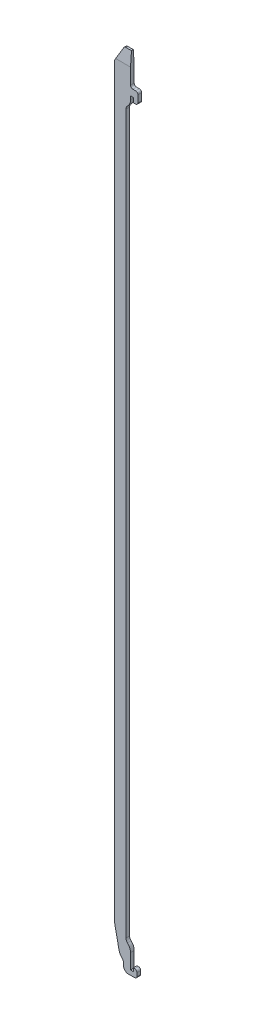
ISO-10303-21;
HEADER;
FILE_DESCRIPTION(('STEP AP214'),'2;1');
FILE_NAME('part.step','',(''),(''),'','','');
FILE_SCHEMA(('AUTOMOTIVE_DESIGN { 1 0 10303 214 1 1 1 1 }'));
ENDSEC;
DATA;
#1=APPLICATION_CONTEXT('core data for automotive mechanical design processes');
#2=APPLICATION_PROTOCOL_DEFINITION('international standard','automotive_design',2000,#1);
#3=PRODUCT_CONTEXT('',#1,'mechanical');
#4=PRODUCT('Part','Part','',(#3));
#5=PRODUCT_RELATED_PRODUCT_CATEGORY('part','',(#4));
#6=PRODUCT_DEFINITION_FORMATION('','',#4);
#7=PRODUCT_DEFINITION_CONTEXT('part definition',#1,'design');
#8=PRODUCT_DEFINITION('design','',#6,#7);
#9=PRODUCT_DEFINITION_SHAPE('','',#8);
#10=(LENGTH_UNIT() NAMED_UNIT(*) SI_UNIT(.MILLI.,.METRE.));
#11=(NAMED_UNIT(*) PLANE_ANGLE_UNIT() SI_UNIT($,.RADIAN.));
#12=(NAMED_UNIT(*) SI_UNIT($,.STERADIAN.) SOLID_ANGLE_UNIT());
#13=UNCERTAINTY_MEASURE_WITH_UNIT(LENGTH_MEASURE(1.E-05),#10,'distance_accuracy_value','');
#14=(GEOMETRIC_REPRESENTATION_CONTEXT(3) GLOBAL_UNCERTAINTY_ASSIGNED_CONTEXT((#13)) GLOBAL_UNIT_ASSIGNED_CONTEXT((#10,
#11,#12)) REPRESENTATION_CONTEXT('',''));
#15=CARTESIAN_POINT('',(0.,0.,0.));
#16=DIRECTION('',(0.,0.,1.));
#17=DIRECTION('',(1.,0.,0.));
#18=AXIS2_PLACEMENT_3D('',#15,#16,#17);
#19=CARTESIAN_POINT('',(0.,1737.,4.));
#20=DIRECTION('',(0.,-1.,0.));
#21=DIRECTION('',(0.,0.,-1.));
#22=AXIS2_PLACEMENT_3D('',#19,#20,#21);
#23=PLANE('',#22);
#24=DIRECTION('',(1.,0.,0.));
#25=VECTOR('',#24,1.);
#26=CARTESIAN_POINT('',(-35.0000000000001,1737.,-2.));
#27=LINE('',#26,#25);
#28=CARTESIAN_POINT('',(-12.1132486540519,1737.,-2.));
#29=VERTEX_POINT('',#28);
#30=CARTESIAN_POINT('',(0.,1737.,-2.));
#31=VERTEX_POINT('',#30);
#32=EDGE_CURVE('E275',#29,#31,#27,.T.);
#33=ORIENTED_EDGE('',*,*,#32,.F.);
#34=DIRECTION('',(0.,0.,-1.));
#35=VECTOR('',#34,1.);
#36=CARTESIAN_POINT('',(-12.1132486540519,1737.,4.));
#37=LINE('',#36,#35);
#38=CARTESIAN_POINT('',(-12.1132486540519,1737.,2.));
#39=VERTEX_POINT('',#38);
#40=EDGE_CURVE('E67',#29,#39,#37,.F.);
#41=ORIENTED_EDGE('',*,*,#40,.T.);
#42=DIRECTION('',(1.,0.,0.));
#43=VECTOR('',#42,1.);
#44=CARTESIAN_POINT('',(-35.0000000000001,1737.,2.));
#45=LINE('',#44,#43);
#46=CARTESIAN_POINT('',(0.,1737.,2.));
#47=VERTEX_POINT('',#46);
#48=EDGE_CURVE('E458',#39,#47,#45,.T.);
#49=ORIENTED_EDGE('',*,*,#48,.T.);
#50=DIRECTION('',(0.,0.,-1.));
#51=VECTOR('',#50,1.);
#52=CARTESIAN_POINT('',(0.,1737.,4.));
#53=LINE('',#52,#51);
#54=EDGE_CURVE('E305',#47,#31,#53,.T.);
#55=ORIENTED_EDGE('',*,*,#54,.T.);
#56=EDGE_LOOP('',(#33,#41,#49,#55));
#57=FACE_BOUND('',#56,.T.);
#58=ADVANCED_FACE('F45',(#57),#23,.F.);
#59=CARTESIAN_POINT('',(0.,1668.,4.));
#60=DIRECTION('',(-1.,0.,0.));
#61=DIRECTION('',(0.,-1.,0.));
#62=AXIS2_PLACEMENT_3D('',#59,#60,#61);
#63=PLANE('',#62);
#64=DIRECTION('',(0.,0.997785157856609,0.0665190105237739));
#65=VECTOR('',#64,1.);
#66=CARTESIAN_POINT('',(0.,1737.,-2.));
#67=LINE('',#66,#65);
#68=CARTESIAN_POINT('',(0.,1707.,-4.));
#69=VERTEX_POINT('',#68);
#70=EDGE_CURVE('E271',#69,#31,#67,.T.);
#71=ORIENTED_EDGE('',*,*,#70,.T.);
#72=ORIENTED_EDGE('',*,*,#54,.F.);
#73=DIRECTION('',(0.,0.997785157856609,-0.0665190105237739));
#74=VECTOR('',#73,1.);
#75=CARTESIAN_POINT('',(0.,1737.,2.));
#76=LINE('',#75,#74);
#77=CARTESIAN_POINT('',(0.,1707.,4.));
#78=VERTEX_POINT('',#77);
#79=EDGE_CURVE('E469',#78,#47,#76,.T.);
#80=ORIENTED_EDGE('',*,*,#79,.F.);
#81=DIRECTION('',(0.,1.,0.));
#82=VECTOR('',#81,1.);
#83=CARTESIAN_POINT('',(0.,1668.,4.));
#84=LINE('',#83,#82);
#85=CARTESIAN_POINT('',(0.,1673.,4.));
#86=VERTEX_POINT('',#85);
#87=EDGE_CURVE('E308',#86,#78,#84,.T.);
#88=ORIENTED_EDGE('',*,*,#87,.F.);
#89=DIRECTION('',(0.,0.,-1.));
#90=VECTOR('',#89,1.);
#91=CARTESIAN_POINT('',(0.,1673.,-4.));
#92=LINE('',#91,#90);
#93=CARTESIAN_POINT('',(0.,1673.,-4.));
#94=VERTEX_POINT('',#93);
#95=EDGE_CURVE('E293',#86,#94,#92,.T.);
#96=ORIENTED_EDGE('',*,*,#95,.T.);
#97=DIRECTION('',(0.,1.,0.));
#98=VECTOR('',#97,1.);
#99=CARTESIAN_POINT('',(0.,1668.,-4.));
#100=LINE('',#99,#98);
#101=EDGE_CURVE('E285',#94,#69,#100,.T.);
#102=ORIENTED_EDGE('',*,*,#101,.T.);
#103=EDGE_LOOP('',(#71,#72,#80,#88,#96,#102));
#104=FACE_BOUND('',#103,.T.);
#105=ADVANCED_FACE('F290',(#104),#63,.F.);
#106=CARTESIAN_POINT('',(0.,0.,-4.));
#107=DIRECTION('',(0.,0.,-1.));
#108=DIRECTION('',(-1.,0.,0.));
#109=AXIS2_PLACEMENT_3D('',#106,#107,#108);
#110=PLANE('',#109);
#111=DIRECTION('',(-0.499999999999999,-0.866025403784439,0.));
#112=VECTOR('',#111,1.);
#113=CARTESIAN_POINT('',(-763.393063186784,440.745190528381,-4.));
#114=LINE('',#113,#112);
#115=CARTESIAN_POINT('',(-34.3301270189224,1703.51923788647,-4.));
#116=VERTEX_POINT('',#115);
#117=CARTESIAN_POINT('',(-32.3205080756888,1707.,-4.));
#118=VERTEX_POINT('',#117);
#119=EDGE_CURVE('E287',#116,#118,#114,.F.);
#120=ORIENTED_EDGE('',*,*,#119,.T.);
#121=DIRECTION('',(1.,0.,0.));
#122=VECTOR('',#121,1.);
#123=CARTESIAN_POINT('',(-35.0000000000001,1707.,-4.));
#124=LINE('',#123,#122);
#125=EDGE_CURVE('E274',#118,#69,#124,.T.);
#126=ORIENTED_EDGE('',*,*,#125,.T.);
#127=ORIENTED_EDGE('',*,*,#101,.F.);
#128=CARTESIAN_POINT('',(5.00000000000008,1673.,-4.));
#129=DIRECTION('',(0.,0.,-1.));
#130=DIRECTION('',(-1.,0.,0.));
#131=AXIS2_PLACEMENT_3D('',#128,#129,#130);
#132=CIRCLE('',#131,5.);
#133=CARTESIAN_POINT('',(5.00000000000008,1668.,-4.));
#134=VERTEX_POINT('',#133);
#135=EDGE_CURVE('E384',#94,#134,#132,.F.);
#136=ORIENTED_EDGE('',*,*,#135,.T.);
#137=DIRECTION('',(-1.,0.,0.));
#138=VECTOR('',#137,1.);
#139=CARTESIAN_POINT('',(15.9999999999999,1668.,-4.));
#140=LINE('',#139,#138);
#141=CARTESIAN_POINT('',(10.9999999999999,1668.,-4.));
#142=VERTEX_POINT('',#141);
#143=EDGE_CURVE('E295',#142,#134,#140,.T.);
#144=ORIENTED_EDGE('',*,*,#143,.F.);
#145=CARTESIAN_POINT('',(10.9999999999999,1663.,-4.));
#146=DIRECTION('',(0.,0.,-1.));
#147=DIRECTION('',(-1.,0.,0.));
#148=AXIS2_PLACEMENT_3D('',#145,#146,#147);
#149=CIRCLE('',#148,5.);
#150=CARTESIAN_POINT('',(15.9999999999999,1663.,-4.));
#151=VERTEX_POINT('',#150);
#152=EDGE_CURVE('E334',#142,#151,#149,.T.);
#153=ORIENTED_EDGE('',*,*,#152,.T.);
#154=DIRECTION('',(0.,1.,0.));
#155=VECTOR('',#154,1.);
#156=CARTESIAN_POINT('',(15.9999999999999,1643.,-4.));
#157=LINE('',#156,#155);
#158=CARTESIAN_POINT('',(15.9999999999999,1648.,-4.));
#159=VERTEX_POINT('',#158);
#160=EDGE_CURVE('E301',#159,#151,#157,.T.);
#161=ORIENTED_EDGE('',*,*,#160,.F.);
#162=CARTESIAN_POINT('',(10.9999999999999,1648.,-4.));
#163=DIRECTION('',(0.,0.,-1.));
#164=DIRECTION('',(-1.,0.,0.));
#165=AXIS2_PLACEMENT_3D('',#162,#163,#164);
#166=CIRCLE('',#165,5.);
#167=CARTESIAN_POINT('',(10.9999999999998,1643.,-4.));
#168=VERTEX_POINT('',#167);
#169=EDGE_CURVE('E336',#159,#168,#166,.T.);
#170=ORIENTED_EDGE('',*,*,#169,.T.);
#171=DIRECTION('',(1.,0.,0.));
#172=VECTOR('',#171,1.);
#173=CARTESIAN_POINT('',(5.9999999999999,1643.,-4.));
#174=LINE('',#173,#172);
#175=CARTESIAN_POINT('',(5.9999999999999,1643.,-4.));
#176=VERTEX_POINT('',#175);
#177=EDGE_CURVE('E540',#176,#168,#174,.T.);
#178=ORIENTED_EDGE('',*,*,#177,.F.);
#179=DIRECTION('',(0.,-1.,0.));
#180=VECTOR('',#179,1.);
#181=CARTESIAN_POINT('',(5.9999999999999,1653.,-4.));
#182=LINE('',#181,#180);
#183=CARTESIAN_POINT('',(5.9999999999999,1653.,-4.));
#184=VERTEX_POINT('',#183);
#185=EDGE_CURVE('E538',#184,#176,#182,.T.);
#186=ORIENTED_EDGE('',*,*,#185,.F.);
#187=DIRECTION('',(1.,0.,0.));
#188=VECTOR('',#187,1.);
#189=CARTESIAN_POINT('',(0.,1653.,-4.));
#190=LINE('',#189,#188);
#191=CARTESIAN_POINT('',(0.,1653.,-4.));
#192=VERTEX_POINT('',#191);
#193=EDGE_CURVE('E536',#192,#184,#190,.T.);
#194=ORIENTED_EDGE('',*,*,#193,.F.);
#195=DIRECTION('',(0.,1.,0.));
#196=VECTOR('',#195,1.);
#197=CARTESIAN_POINT('',(0.,1653.,-4.));
#198=LINE('',#197,#196);
#199=CARTESIAN_POINT('',(0.,1645.32050807569,-4.));
#200=VERTEX_POINT('',#199);
#201=EDGE_CURVE('E532',#200,#192,#198,.T.);
#202=ORIENTED_EDGE('',*,*,#201,.F.);
#203=CARTESIAN_POINT('',(-20.0000000000001,1645.32050807569,-4.));
#204=DIRECTION('',(0.,0.,-1.));
#205=DIRECTION('',(-1.,0.,0.));
#206=AXIS2_PLACEMENT_3D('',#203,#204,#205);
#207=CIRCLE('',#206,20.);
#208=CARTESIAN_POINT('',(-6.66666666666673,1630.41338822569,-4.));
#209=VERTEX_POINT('',#208);
#210=EDGE_CURVE('E393',#200,#209,#207,.T.);
#211=ORIENTED_EDGE('',*,*,#210,.T.);
#212=CARTESIAN_POINT('',(0.,1622.95982830069,-4.));
#213=DIRECTION('',(0.,0.,-1.));
#214=DIRECTION('',(-1.,0.,0.));
#215=AXIS2_PLACEMENT_3D('',#212,#213,#214);
#216=CIRCLE('',#215,10.);
#217=CARTESIAN_POINT('',(-10.,1622.95982830069,-4.));
#218=VERTEX_POINT('',#217);
#219=EDGE_CURVE('E416',#209,#218,#216,.F.);
#220=ORIENTED_EDGE('',*,*,#219,.T.);
#221=DIRECTION('',(0.,-1.,0.));
#222=VECTOR('',#221,1.);
#223=CARTESIAN_POINT('',(-10.,60.,-4.));
#224=LINE('',#223,#222);
#225=CARTESIAN_POINT('',(-10.,65.0401716993091,-4.));
#226=VERTEX_POINT('',#225);
#227=EDGE_CURVE('E484',#218,#226,#224,.T.);
#228=ORIENTED_EDGE('',*,*,#227,.T.);
#229=CARTESIAN_POINT('',(0.,65.0401716993091,-4.));
#230=DIRECTION('',(0.,0.,-1.));
#231=DIRECTION('',(-1.,0.,0.));
#232=AXIS2_PLACEMENT_3D('',#229,#230,#231);
#233=CIRCLE('',#232,10.);
#234=CARTESIAN_POINT('',(-6.66666666666667,57.5866117743098,-4.));
#235=VERTEX_POINT('',#234);
#236=EDGE_CURVE('E420',#226,#235,#233,.F.);
#237=ORIENTED_EDGE('',*,*,#236,.T.);
#238=CARTESIAN_POINT('',(-20.,42.6794919243112,-4.));
#239=DIRECTION('',(0.,0.,-1.));
#240=DIRECTION('',(-1.,0.,0.));
#241=AXIS2_PLACEMENT_3D('',#238,#239,#240);
#242=CIRCLE('',#241,20.);
#243=CARTESIAN_POINT('',(0.,42.6794919243112,-4.));
#244=VERTEX_POINT('',#243);
#245=EDGE_CURVE('E391',#235,#244,#242,.T.);
#246=ORIENTED_EDGE('',*,*,#245,.T.);
#247=CARTESIAN_POINT('',(0.,10.,-4.));
#248=VERTEX_POINT('',#247);
#249=EDGE_CURVE('E533',#248,#244,#198,.T.);
#250=ORIENTED_EDGE('',*,*,#249,.F.);
#251=DIRECTION('',(-1.,0.,0.));
#252=VECTOR('',#251,1.);
#253=CARTESIAN_POINT('',(0.,10.,-4.));
#254=LINE('',#253,#252);
#255=CARTESIAN_POINT('',(5.99999999999999,10.,-4.));
#256=VERTEX_POINT('',#255);
#257=EDGE_CURVE('E530',#256,#248,#254,.T.);
#258=ORIENTED_EDGE('',*,*,#257,.F.);
#259=DIRECTION('',(0.,-1.,0.));
#260=VECTOR('',#259,1.);
#261=CARTESIAN_POINT('',(5.99999999999999,10.,-4.));
#262=LINE('',#261,#260);
#263=CARTESIAN_POINT('',(5.99999999999999,17.,-4.));
#264=VERTEX_POINT('',#263);
#265=EDGE_CURVE('E528',#264,#256,#262,.T.);
#266=ORIENTED_EDGE('',*,*,#265,.F.);
#267=DIRECTION('',(-1.,0.,0.));
#268=VECTOR('',#267,1.);
#269=CARTESIAN_POINT('',(5.99999999999999,17.,-4.));
#270=LINE('',#269,#268);
#271=CARTESIAN_POINT('',(9.,17.,-4.));
#272=VERTEX_POINT('',#271);
#273=EDGE_CURVE('E526',#272,#264,#270,.T.);
#274=ORIENTED_EDGE('',*,*,#273,.F.);
#275=CARTESIAN_POINT('',(9.,12.,-4.));
#276=DIRECTION('',(0.,0.,-1.));
#277=DIRECTION('',(-1.,0.,0.));
#278=AXIS2_PLACEMENT_3D('',#275,#276,#277);
#279=CIRCLE('',#278,5.);
#280=CARTESIAN_POINT('',(14.,12.,-4.));
#281=VERTEX_POINT('',#280);
#282=EDGE_CURVE('E340',#272,#281,#279,.T.);
#283=ORIENTED_EDGE('',*,*,#282,.T.);
#284=DIRECTION('',(0.,1.,0.));
#285=VECTOR('',#284,1.);
#286=CARTESIAN_POINT('',(14.,17.,-4.));
#287=LINE('',#286,#285);
#288=CARTESIAN_POINT('',(14.,5.,-4.));
#289=VERTEX_POINT('',#288);
#290=EDGE_CURVE('E523',#289,#281,#287,.T.);
#291=ORIENTED_EDGE('',*,*,#290,.F.);
#292=CARTESIAN_POINT('',(9.,5.,-4.));
#293=DIRECTION('',(0.,0.,-1.));
#294=DIRECTION('',(-1.,0.,0.));
#295=AXIS2_PLACEMENT_3D('',#292,#293,#294);
#296=CIRCLE('',#295,5.);
#297=CARTESIAN_POINT('',(9.,0.,-4.));
#298=VERTEX_POINT('',#297);
#299=EDGE_CURVE('E342',#289,#298,#296,.T.);
#300=ORIENTED_EDGE('',*,*,#299,.T.);
#301=DIRECTION('',(1.,0.,0.));
#302=VECTOR('',#301,1.);
#303=CARTESIAN_POINT('',(-35.0000000000001,0.,-4.));
#304=LINE('',#303,#302);
#305=CARTESIAN_POINT('',(-5.0000000000001,0.,-4.));
#306=VERTEX_POINT('',#305);
#307=EDGE_CURVE('E521',#306,#298,#304,.T.);
#308=ORIENTED_EDGE('',*,*,#307,.F.);
#309=CARTESIAN_POINT('',(-5.0000000000001,10.,-4.));
#310=DIRECTION('',(0.,0.,-1.));
#311=DIRECTION('',(-1.,0.,0.));
#312=AXIS2_PLACEMENT_3D('',#309,#310,#311);
#313=CIRCLE('',#312,10.);
#314=CARTESIAN_POINT('',(-15.0000000000001,10.,-4.));
#315=VERTEX_POINT('',#314);
#316=EDGE_CURVE('E434',#306,#315,#313,.T.);
#317=ORIENTED_EDGE('',*,*,#316,.T.);
#318=DIRECTION('',(0.,1.,0.));
#319=VECTOR('',#318,1.);
#320=CARTESIAN_POINT('',(-15.0000000000001,15.,-4.));
#321=LINE('',#320,#319);
#322=CARTESIAN_POINT('',(-15.0000000000001,15.,-4.));
#323=VERTEX_POINT('',#322);
#324=EDGE_CURVE('E464',#315,#323,#321,.T.);
#325=ORIENTED_EDGE('',*,*,#324,.T.);
#326=CARTESIAN_POINT('',(-25.0000000000001,15.,-4.));
#327=DIRECTION('',(0.,0.,1.));
#328=DIRECTION('',(1.,0.,0.));
#329=AXIS2_PLACEMENT_3D('',#326,#327,#328);
#330=CIRCLE('',#329,10.);
#331=CARTESIAN_POINT('',(-17.7193766126247,21.8551092690929,-4.));
#332=VERTEX_POINT('',#331);
#333=EDGE_CURVE('E476',#323,#332,#330,.T.);
#334=ORIENTED_EDGE('',*,*,#333,.T.);
#335=CARTESIAN_POINT('',(4.1224935495014,42.4204370763714,-4.));
#336=DIRECTION('',(0.,0.,-1.));
#337=DIRECTION('',(-1.,0.,0.));
#338=AXIS2_PLACEMENT_3D('',#335,#336,#337);
#339=CIRCLE('',#338,30.);
#340=CARTESIAN_POINT('',(-25.2535850716724,36.3338941460525,-4.));
#341=VERTEX_POINT('',#340);
#342=EDGE_CURVE('E447',#332,#341,#339,.T.);
#343=ORIENTED_EDGE('',*,*,#342,.T.);
#344=DIRECTION('',(0.202884764343964,-0.979202620705794,0.));
#345=VECTOR('',#344,1.);
#346=CARTESIAN_POINT('',(-16.9958075307362,-3.52142685568323,-4.));
#347=LINE('',#346,#345);
#348=CARTESIAN_POINT('',(-35.0000000000001,83.3739716558868,-4.));
#349=VERTEX_POINT('',#348);
#350=EDGE_CURVE('E442',#341,#349,#347,.F.);
#351=ORIENTED_EDGE('',*,*,#350,.T.);
#352=DIRECTION('',(0.,-1.,0.));
#353=VECTOR('',#352,1.);
#354=CARTESIAN_POINT('',(-35.0000000000001,0.,-4.));
#355=LINE('',#354,#353);
#356=CARTESIAN_POINT('',(-35.0000000000001,1701.01923788647,-4.));
#357=VERTEX_POINT('',#356);
#358=EDGE_CURVE('E487',#357,#349,#355,.T.);
#359=ORIENTED_EDGE('',*,*,#358,.F.);
#360=CARTESIAN_POINT('',(-30.0000000000001,1701.01923788647,-4.));
#361=DIRECTION('',(0.,0.,-1.));
#362=DIRECTION('',(-1.,0.,0.));
#363=AXIS2_PLACEMENT_3D('',#360,#361,#362);
#364=CIRCLE('',#363,5.);
#365=EDGE_CURVE('E338',#357,#116,#364,.T.);
#366=ORIENTED_EDGE('',*,*,#365,.T.);
#367=EDGE_LOOP('',(#120,#126,#127,#136,#144,#153,#161,#170,#178,#186,#194,#202,#211,#220,#228,
#237,#246,#250,#258,#266,#274,#283,#291,#300,#308,#317,#325,#334,#343,#351,#359,#366));
#368=FACE_BOUND('',#367,.T.);
#369=ADVANCED_FACE('F284',(#368),#110,.T.);
#370=CARTESIAN_POINT('',(-35.0000000000001,1702.35898384862,4.));
#371=DIRECTION('',(0.866025403784439,-0.499999999999999,0.));
#372=DIRECTION('',(0.,0.,-1.));
#373=AXIS2_PLACEMENT_3D('',#370,#371,#372);
#374=PLANE('',#373);
#375=DIRECTION('',(0.,0.,1.));
#376=VECTOR('',#375,1.);
#377=CARTESIAN_POINT('',(-16.4433756729741,1734.5,-4.));
#378=LINE('',#377,#376);
#379=CARTESIAN_POINT('',(-16.4433756729741,1734.5,2.16666666666666));
#380=VERTEX_POINT('',#379);
#381=CARTESIAN_POINT('',(-16.4433756729741,1734.5,-2.16666666666666));
#382=VERTEX_POINT('',#381);
#383=EDGE_CURVE('E370',#380,#382,#378,.F.);
#384=ORIENTED_EDGE('',*,*,#383,.T.);
#385=DIRECTION('',(0.49916874422979,0.864585626556353,0.0576390417704235));
#386=VECTOR('',#385,1.);
#387=CARTESIAN_POINT('',(-34.7609251686809,1702.77307360328,-4.2817950931148));
#388=LINE('',#387,#386);
#389=EDGE_CURVE('E60',#382,#118,#388,.F.);
#390=ORIENTED_EDGE('',*,*,#389,.T.);
#391=ORIENTED_EDGE('',*,*,#119,.F.);
#392=DIRECTION('',(0.,0.,-1.));
#393=VECTOR('',#392,1.);
#394=CARTESIAN_POINT('',(-34.3301270189223,1703.51923788647,4.));
#395=LINE('',#394,#393);
#396=CARTESIAN_POINT('',(-34.3301270189223,1703.51923788647,4.));
#397=VERTEX_POINT('',#396);
#398=EDGE_CURVE('E373',#116,#397,#395,.F.);
#399=ORIENTED_EDGE('',*,*,#398,.T.);
#400=DIRECTION('',(0.499999999999999,0.866025403784439,0.));
#401=VECTOR('',#400,1.);
#402=CARTESIAN_POINT('',(-35.0000000000001,1702.35898384862,4.));
#403=LINE('',#402,#401);
#404=CARTESIAN_POINT('',(-32.3205080756888,1707.,4.));
#405=VERTEX_POINT('',#404);
#406=EDGE_CURVE('E327',#405,#397,#403,.F.);
#407=ORIENTED_EDGE('',*,*,#406,.F.);
#408=DIRECTION('',(0.49916874422979,0.864585626556353,-0.0576390417704235));
#409=VECTOR('',#408,1.);
#410=CARTESIAN_POINT('',(-34.9910980334742,1702.37440250693,4.3083731662045));
#411=LINE('',#410,#409);
#412=EDGE_CURVE('E456',#380,#405,#411,.F.);
#413=ORIENTED_EDGE('',*,*,#412,.F.);
#414=EDGE_LOOP('',(#384,#390,#391,#399,#407,#413));
#415=FACE_BOUND('',#414,.T.);
#416=ADVANCED_FACE('F463',(#415),#374,.F.);
#417=CARTESIAN_POINT('',(-12.1132486540519,1732.,4.));
#418=DIRECTION('',(0.,0.,1.));
#419=DIRECTION('',(1.,0.,0.));
#420=AXIS2_PLACEMENT_3D('',#417,#418,#419);
#421=CYLINDRICAL_SURFACE('',#420,5.);
#422=ORIENTED_EDGE('',*,*,#40,.F.);
#423=CARTESIAN_POINT('',(-12.1132486540519,1732.,-2.33333333333333));
#424=DIRECTION('',(0.,0.0665190105237739,-0.997785157856609));
#425=DIRECTION('',(0.,0.997785157856609,0.0665190105237739));
#426=AXIS2_PLACEMENT_3D('',#423,#424,#425);
#427=ELLIPSE('',#426,5.01109879279097,5.);
#428=EDGE_CURVE('E11',#29,#382,#427,.F.);
#429=ORIENTED_EDGE('',*,*,#428,.T.);
#430=ORIENTED_EDGE('',*,*,#383,.F.);
#431=CARTESIAN_POINT('',(-12.1132486540519,1732.,2.33333333333333));
#432=DIRECTION('',(0.,-0.0665190105237739,-0.997785157856609));
#433=DIRECTION('',(0.,-0.997785157856609,0.0665190105237739));
#434=AXIS2_PLACEMENT_3D('',#431,#432,#433);
#435=ELLIPSE('',#434,5.01109879279097,5.);
#436=EDGE_CURVE('E53',#39,#380,#435,.F.);
#437=ORIENTED_EDGE('',*,*,#436,.F.);
#438=EDGE_LOOP('',(#422,#429,#430,#437));
#439=FACE_BOUND('',#438,.T.);
#440=ADVANCED_FACE('F467',(#439),#421,.T.);
#441=CARTESIAN_POINT('',(0.,1653.,4.));
#442=DIRECTION('',(-1.,0.,0.));
#443=DIRECTION('',(0.,-1.,0.));
#444=AXIS2_PLACEMENT_3D('',#441,#442,#443);
#445=PLANE('',#444);
#446=ORIENTED_EDGE('',*,*,#249,.T.);
#447=DIRECTION('',(0.,0.,-1.));
#448=VECTOR('',#447,1.);
#449=CARTESIAN_POINT('',(0.,42.6794919243112,4.));
#450=LINE('',#449,#448);
#451=CARTESIAN_POINT('',(0.,42.6794919243112,4.));
#452=VERTEX_POINT('',#451);
#453=EDGE_CURVE('E401',#244,#452,#450,.F.);
#454=ORIENTED_EDGE('',*,*,#453,.T.);
#455=DIRECTION('',(0.,1.,0.));
#456=VECTOR('',#455,1.);
#457=CARTESIAN_POINT('',(0.,1653.,4.));
#458=LINE('',#457,#456);
#459=CARTESIAN_POINT('',(0.,10.,4.));
#460=VERTEX_POINT('',#459);
#461=EDGE_CURVE('E501',#460,#452,#458,.T.);
#462=ORIENTED_EDGE('',*,*,#461,.F.);
#463=DIRECTION('',(0.,0.,-1.));
#464=VECTOR('',#463,1.);
#465=CARTESIAN_POINT('',(0.,10.,4.));
#466=LINE('',#465,#464);
#467=EDGE_CURVE('E317',#460,#248,#466,.T.);
#468=ORIENTED_EDGE('',*,*,#467,.T.);
#469=EDGE_LOOP('',(#446,#454,#462,#468));
#470=FACE_BOUND('',#469,.T.);
#471=ADVANCED_FACE('F630',(#470),#445,.F.);
#472=CARTESIAN_POINT('',(-35.0000000000001,0.,4.));
#473=DIRECTION('',(1.,0.,0.));
#474=DIRECTION('',(0.,0.,-1.));
#475=AXIS2_PLACEMENT_3D('',#472,#473,#474);
#476=PLANE('',#475);
#477=ORIENTED_EDGE('',*,*,#358,.T.);
#478=DIRECTION('',(0.,0.,1.));
#479=VECTOR('',#478,1.);
#480=CARTESIAN_POINT('',(-35.0000000000001,83.3739716558868,4.));
#481=LINE('',#480,#479);
#482=CARTESIAN_POINT('',(-35.0000000000001,83.3739716558868,4.));
#483=VERTEX_POINT('',#482);
#484=EDGE_CURVE('E436',#349,#483,#481,.T.);
#485=ORIENTED_EDGE('',*,*,#484,.T.);
#486=DIRECTION('',(0.,-1.,0.));
#487=VECTOR('',#486,1.);
#488=CARTESIAN_POINT('',(-35.0000000000001,0.,4.));
#489=LINE('',#488,#487);
#490=CARTESIAN_POINT('',(-35.0000000000001,1701.01923788647,4.));
#491=VERTEX_POINT('',#490);
#492=EDGE_CURVE('E294',#491,#483,#489,.T.);
#493=ORIENTED_EDGE('',*,*,#492,.F.);
#494=DIRECTION('',(0.,0.,1.));
#495=VECTOR('',#494,1.);
#496=CARTESIAN_POINT('',(-35.0000000000001,1701.01923788647,-4.));
#497=LINE('',#496,#495);
#498=EDGE_CURVE('E367',#491,#357,#497,.F.);
#499=ORIENTED_EDGE('',*,*,#498,.T.);
#500=EDGE_LOOP('',(#477,#485,#493,#499));
#501=FACE_BOUND('',#500,.T.);
#502=ADVANCED_FACE('F572',(#501),#476,.F.);
#503=CARTESIAN_POINT('',(-35.0000000000001,0.,4.));
#504=DIRECTION('',(0.,1.,0.));
#505=DIRECTION('',(-1.,0.,0.));
#506=AXIS2_PLACEMENT_3D('',#503,#504,#505);
#507=PLANE('',#506);
#508=DIRECTION('',(1.,0.,0.));
#509=VECTOR('',#508,1.);
#510=CARTESIAN_POINT('',(-35.0000000000001,0.,4.));
#511=LINE('',#510,#509);
#512=CARTESIAN_POINT('',(-5.0000000000001,0.,4.));
#513=VERTEX_POINT('',#512);
#514=CARTESIAN_POINT('',(9.,0.,4.));
#515=VERTEX_POINT('',#514);
#516=EDGE_CURVE('E298',#513,#515,#511,.T.);
#517=ORIENTED_EDGE('',*,*,#516,.F.);
#518=DIRECTION('',(0.,0.,1.));
#519=VECTOR('',#518,1.);
#520=CARTESIAN_POINT('',(-5.0000000000001,0.,4.));
#521=LINE('',#520,#519);
#522=EDGE_CURVE('E432',#513,#306,#521,.F.);
#523=ORIENTED_EDGE('',*,*,#522,.T.);
#524=ORIENTED_EDGE('',*,*,#307,.T.);
#525=DIRECTION('',(0.,0.,-1.));
#526=VECTOR('',#525,1.);
#527=CARTESIAN_POINT('',(9.,0.,4.));
#528=LINE('',#527,#526);
#529=EDGE_CURVE('E345',#298,#515,#528,.F.);
#530=ORIENTED_EDGE('',*,*,#529,.T.);
#531=EDGE_LOOP('',(#517,#523,#524,#530));
#532=FACE_BOUND('',#531,.T.);
#533=ADVANCED_FACE('F594',(#532),#507,.F.);
#534=CARTESIAN_POINT('',(14.,17.,4.));
#535=DIRECTION('',(-1.,0.,0.));
#536=DIRECTION('',(0.,-1.,0.));
#537=AXIS2_PLACEMENT_3D('',#534,#535,#536);
#538=PLANE('',#537);
#539=DIRECTION('',(0.,1.,0.));
#540=VECTOR('',#539,1.);
#541=CARTESIAN_POINT('',(14.,17.,4.));
#542=LINE('',#541,#540);
#543=CARTESIAN_POINT('',(14.,5.,4.));
#544=VERTEX_POINT('',#543);
#545=CARTESIAN_POINT('',(14.,12.,4.));
#546=VERTEX_POINT('',#545);
#547=EDGE_CURVE('E491',#544,#546,#542,.T.);
#548=ORIENTED_EDGE('',*,*,#547,.F.);
#549=DIRECTION('',(0.,0.,-1.));
#550=VECTOR('',#549,1.);
#551=CARTESIAN_POINT('',(14.,5.,4.));
#552=LINE('',#551,#550);
#553=EDGE_CURVE('E331',#544,#289,#552,.T.);
#554=ORIENTED_EDGE('',*,*,#553,.T.);
#555=ORIENTED_EDGE('',*,*,#290,.T.);
#556=DIRECTION('',(0.,0.,-1.));
#557=VECTOR('',#556,1.);
#558=CARTESIAN_POINT('',(14.,12.,4.));
#559=LINE('',#558,#557);
#560=EDGE_CURVE('E329',#281,#546,#559,.F.);
#561=ORIENTED_EDGE('',*,*,#560,.T.);
#562=EDGE_LOOP('',(#548,#554,#555,#561));
#563=FACE_BOUND('',#562,.T.);
#564=ADVANCED_FACE('F607',(#563),#538,.F.);
#565=CARTESIAN_POINT('',(5.99999999999999,17.,4.));
#566=DIRECTION('',(0.,-1.,0.));
#567=DIRECTION('',(1.,0.,0.));
#568=AXIS2_PLACEMENT_3D('',#565,#566,#567);
#569=PLANE('',#568);
#570=DIRECTION('',(-1.,0.,0.));
#571=VECTOR('',#570,1.);
#572=CARTESIAN_POINT('',(5.99999999999999,17.,4.));
#573=LINE('',#572,#571);
#574=CARTESIAN_POINT('',(9.,17.,4.));
#575=VERTEX_POINT('',#574);
#576=CARTESIAN_POINT('',(5.99999999999999,17.,4.));
#577=VERTEX_POINT('',#576);
#578=EDGE_CURVE('E494',#575,#577,#573,.T.);
#579=ORIENTED_EDGE('',*,*,#578,.F.);
#580=DIRECTION('',(0.,0.,-1.));
#581=VECTOR('',#580,1.);
#582=CARTESIAN_POINT('',(9.,17.,4.));
#583=LINE('',#582,#581);
#584=EDGE_CURVE('E358',#575,#272,#583,.T.);
#585=ORIENTED_EDGE('',*,*,#584,.T.);
#586=ORIENTED_EDGE('',*,*,#273,.T.);
#587=DIRECTION('',(0.,0.,-1.));
#588=VECTOR('',#587,1.);
#589=CARTESIAN_POINT('',(5.99999999999999,17.,4.));
#590=LINE('',#589,#588);
#591=EDGE_CURVE('E323',#577,#264,#590,.T.);
#592=ORIENTED_EDGE('',*,*,#591,.F.);
#593=EDGE_LOOP('',(#579,#585,#586,#592));
#594=FACE_BOUND('',#593,.T.);
#595=ADVANCED_FACE('F615',(#594),#569,.F.);
#596=CARTESIAN_POINT('',(5.99999999999999,10.,4.));
#597=DIRECTION('',(1.,0.,0.));
#598=DIRECTION('',(0.,1.,0.));
#599=AXIS2_PLACEMENT_3D('',#596,#597,#598);
#600=PLANE('',#599);
#601=ORIENTED_EDGE('',*,*,#265,.T.);
#602=DIRECTION('',(0.,0.,-1.));
#603=VECTOR('',#602,1.);
#604=CARTESIAN_POINT('',(5.99999999999999,10.,4.));
#605=LINE('',#604,#603);
#606=CARTESIAN_POINT('',(5.99999999999999,10.,4.));
#607=VERTEX_POINT('',#606);
#608=EDGE_CURVE('E320',#607,#256,#605,.T.);
#609=ORIENTED_EDGE('',*,*,#608,.F.);
#610=DIRECTION('',(0.,-1.,0.));
#611=VECTOR('',#610,1.);
#612=CARTESIAN_POINT('',(5.99999999999999,10.,4.));
#613=LINE('',#612,#611);
#614=EDGE_CURVE('E496',#577,#607,#613,.T.);
#615=ORIENTED_EDGE('',*,*,#614,.F.);
#616=ORIENTED_EDGE('',*,*,#591,.T.);
#617=EDGE_LOOP('',(#601,#609,#615,#616));
#618=FACE_BOUND('',#617,.T.);
#619=ADVANCED_FACE('F621',(#618),#600,.F.);
#620=CARTESIAN_POINT('',(0.,10.,4.));
#621=DIRECTION('',(0.,-1.,0.));
#622=DIRECTION('',(0.,0.,-1.));
#623=AXIS2_PLACEMENT_3D('',#620,#621,#622);
#624=PLANE('',#623);
#625=ORIENTED_EDGE('',*,*,#257,.T.);
#626=ORIENTED_EDGE('',*,*,#467,.F.);
#627=DIRECTION('',(-1.,0.,0.));
#628=VECTOR('',#627,1.);
#629=CARTESIAN_POINT('',(0.,10.,4.));
#630=LINE('',#629,#628);
#631=EDGE_CURVE('E498',#607,#460,#630,.T.);
#632=ORIENTED_EDGE('',*,*,#631,.F.);
#633=ORIENTED_EDGE('',*,*,#608,.T.);
#634=EDGE_LOOP('',(#625,#626,#632,#633));
#635=FACE_BOUND('',#634,.T.);
#636=ADVANCED_FACE('F626',(#635),#624,.F.);
#637=CARTESIAN_POINT('',(0.,1645.32050807569,4.));
#638=VERTEX_POINT('',#637);
#639=CARTESIAN_POINT('',(0.,1653.,4.));
#640=VERTEX_POINT('',#639);
#641=EDGE_CURVE('E500',#638,#640,#458,.T.);
#642=ORIENTED_EDGE('',*,*,#641,.F.);
#643=DIRECTION('',(0.,0.,1.));
#644=VECTOR('',#643,1.);
#645=CARTESIAN_POINT('',(0.,1645.32050807569,4.));
#646=LINE('',#645,#644);
#647=EDGE_CURVE('E388',#638,#200,#646,.F.);
#648=ORIENTED_EDGE('',*,*,#647,.T.);
#649=ORIENTED_EDGE('',*,*,#201,.T.);
#650=DIRECTION('',(0.,0.,-1.));
#651=VECTOR('',#650,1.);
#652=CARTESIAN_POINT('',(0.,1653.,4.));
#653=LINE('',#652,#651);
#654=EDGE_CURVE('E314',#640,#192,#653,.T.);
#655=ORIENTED_EDGE('',*,*,#654,.F.);
#656=EDGE_LOOP('',(#642,#648,#649,#655));
#657=FACE_BOUND('',#656,.T.);
#658=ADVANCED_FACE('F656',(#657),#445,.F.);
#659=CARTESIAN_POINT('',(0.,1653.,4.));
#660=DIRECTION('',(0.,1.,0.));
#661=DIRECTION('',(0.,0.,1.));
#662=AXIS2_PLACEMENT_3D('',#659,#660,#661);
#663=PLANE('',#662);
#664=ORIENTED_EDGE('',*,*,#193,.T.);
#665=DIRECTION('',(0.,0.,-1.));
#666=VECTOR('',#665,1.);
#667=CARTESIAN_POINT('',(5.9999999999999,1653.,4.));
#668=LINE('',#667,#666);
#669=CARTESIAN_POINT('',(5.9999999999999,1653.,4.));
#670=VERTEX_POINT('',#669);
#671=EDGE_CURVE('E311',#670,#184,#668,.T.);
#672=ORIENTED_EDGE('',*,*,#671,.F.);
#673=DIRECTION('',(1.,0.,0.));
#674=VECTOR('',#673,1.);
#675=CARTESIAN_POINT('',(0.,1653.,4.));
#676=LINE('',#675,#674);
#677=EDGE_CURVE('E504',#640,#670,#676,.T.);
#678=ORIENTED_EDGE('',*,*,#677,.F.);
#679=ORIENTED_EDGE('',*,*,#654,.T.);
#680=EDGE_LOOP('',(#664,#672,#678,#679));
#681=FACE_BOUND('',#680,.T.);
#682=ADVANCED_FACE('F663',(#681),#663,.F.);
#683=CARTESIAN_POINT('',(5.9999999999999,1653.,4.));
#684=DIRECTION('',(1.,0.,0.));
#685=DIRECTION('',(0.,0.,-1.));
#686=AXIS2_PLACEMENT_3D('',#683,#684,#685);
#687=PLANE('',#686);
#688=ORIENTED_EDGE('',*,*,#185,.T.);
#689=DIRECTION('',(0.,0.,-1.));
#690=VECTOR('',#689,1.);
#691=CARTESIAN_POINT('',(5.9999999999999,1643.,4.));
#692=LINE('',#691,#690);
#693=CARTESIAN_POINT('',(5.9999999999999,1643.,4.));
#694=VERTEX_POINT('',#693);
#695=EDGE_CURVE('E307',#694,#176,#692,.T.);
#696=ORIENTED_EDGE('',*,*,#695,.F.);
#697=DIRECTION('',(0.,-1.,0.));
#698=VECTOR('',#697,1.);
#699=CARTESIAN_POINT('',(5.9999999999999,1653.,4.));
#700=LINE('',#699,#698);
#701=EDGE_CURVE('E506',#670,#694,#700,.T.);
#702=ORIENTED_EDGE('',*,*,#701,.F.);
#703=ORIENTED_EDGE('',*,*,#671,.T.);
#704=EDGE_LOOP('',(#688,#696,#702,#703));
#705=FACE_BOUND('',#704,.T.);
#706=ADVANCED_FACE('F667',(#705),#687,.F.);
#707=CARTESIAN_POINT('',(5.9999999999999,1643.,4.));
#708=DIRECTION('',(0.,1.,0.));
#709=DIRECTION('',(-1.,0.,0.));
#710=AXIS2_PLACEMENT_3D('',#707,#708,#709);
#711=PLANE('',#710);
#712=ORIENTED_EDGE('',*,*,#177,.T.);
#713=DIRECTION('',(0.,0.,-1.));
#714=VECTOR('',#713,1.);
#715=CARTESIAN_POINT('',(10.9999999999998,1643.,4.));
#716=LINE('',#715,#714);
#717=CARTESIAN_POINT('',(10.9999999999998,1643.,4.));
#718=VERTEX_POINT('',#717);
#719=EDGE_CURVE('E382',#168,#718,#716,.F.);
#720=ORIENTED_EDGE('',*,*,#719,.T.);
#721=DIRECTION('',(1.,0.,0.));
#722=VECTOR('',#721,1.);
#723=CARTESIAN_POINT('',(5.9999999999999,1643.,4.));
#724=LINE('',#723,#722);
#725=EDGE_CURVE('E508',#694,#718,#724,.T.);
#726=ORIENTED_EDGE('',*,*,#725,.F.);
#727=ORIENTED_EDGE('',*,*,#695,.T.);
#728=EDGE_LOOP('',(#712,#720,#726,#727));
#729=FACE_BOUND('',#728,.T.);
#730=ADVANCED_FACE('F675',(#729),#711,.F.);
#731=CARTESIAN_POINT('',(15.9999999999999,1643.,4.));
#732=DIRECTION('',(-1.,0.,0.));
#733=DIRECTION('',(0.,0.,1.));
#734=AXIS2_PLACEMENT_3D('',#731,#732,#733);
#735=PLANE('',#734);
#736=DIRECTION('',(0.,1.,0.));
#737=VECTOR('',#736,1.);
#738=CARTESIAN_POINT('',(15.9999999999999,1643.,4.));
#739=LINE('',#738,#737);
#740=CARTESIAN_POINT('',(15.9999999999999,1648.,4.));
#741=VERTEX_POINT('',#740);
#742=CARTESIAN_POINT('',(15.9999999999999,1663.,4.));
#743=VERTEX_POINT('',#742);
#744=EDGE_CURVE('E511',#741,#743,#739,.T.);
#745=ORIENTED_EDGE('',*,*,#744,.F.);
#746=DIRECTION('',(0.,0.,-1.));
#747=VECTOR('',#746,1.);
#748=CARTESIAN_POINT('',(15.9999999999999,1648.,4.));
#749=LINE('',#748,#747);
#750=EDGE_CURVE('E379',#741,#159,#749,.T.);
#751=ORIENTED_EDGE('',*,*,#750,.T.);
#752=ORIENTED_EDGE('',*,*,#160,.T.);
#753=DIRECTION('',(0.,0.,-1.));
#754=VECTOR('',#753,1.);
#755=CARTESIAN_POINT('',(15.9999999999999,1663.,4.));
#756=LINE('',#755,#754);
#757=EDGE_CURVE('E377',#151,#743,#756,.F.);
#758=ORIENTED_EDGE('',*,*,#757,.T.);
#759=EDGE_LOOP('',(#745,#751,#752,#758));
#760=FACE_BOUND('',#759,.T.);
#761=ADVANCED_FACE('F547',(#760),#735,.F.);
#762=CARTESIAN_POINT('',(15.9999999999999,1668.,4.));
#763=DIRECTION('',(0.,-1.,0.));
#764=DIRECTION('',(0.,0.,-1.));
#765=AXIS2_PLACEMENT_3D('',#762,#763,#764);
#766=PLANE('',#765);
#767=ORIENTED_EDGE('',*,*,#143,.T.);
#768=DIRECTION('',(0.,0.,-1.));
#769=VECTOR('',#768,1.);
#770=CARTESIAN_POINT('',(5.00000000000008,1668.,4.));
#771=LINE('',#770,#769);
#772=CARTESIAN_POINT('',(5.00000000000008,1668.,4.));
#773=VERTEX_POINT('',#772);
#774=EDGE_CURVE('E365',#134,#773,#771,.F.);
#775=ORIENTED_EDGE('',*,*,#774,.T.);
#776=DIRECTION('',(-1.,0.,0.));
#777=VECTOR('',#776,1.);
#778=CARTESIAN_POINT('',(15.9999999999999,1668.,4.));
#779=LINE('',#778,#777);
#780=CARTESIAN_POINT('',(10.9999999999999,1668.,4.));
#781=VERTEX_POINT('',#780);
#782=EDGE_CURVE('E514',#781,#773,#779,.T.);
#783=ORIENTED_EDGE('',*,*,#782,.F.);
#784=DIRECTION('',(0.,0.,-1.));
#785=VECTOR('',#784,1.);
#786=CARTESIAN_POINT('',(10.9999999999999,1668.,4.));
#787=LINE('',#786,#785);
#788=EDGE_CURVE('E362',#781,#142,#787,.T.);
#789=ORIENTED_EDGE('',*,*,#788,.T.);
#790=EDGE_LOOP('',(#767,#775,#783,#789));
#791=FACE_BOUND('',#790,.T.);
#792=ADVANCED_FACE('F558',(#791),#766,.F.);
#793=CARTESIAN_POINT('',(0.,0.,4.));
#794=DIRECTION('',(0.,0.,-1.));
#795=DIRECTION('',(-1.,0.,0.));
#796=AXIS2_PLACEMENT_3D('',#793,#794,#795);
#797=PLANE('',#796);
#798=ORIENTED_EDGE('',*,*,#87,.T.);
#799=DIRECTION('',(1.,0.,0.));
#800=VECTOR('',#799,1.);
#801=CARTESIAN_POINT('',(-35.0000000000001,1707.,4.));
#802=LINE('',#801,#800);
#803=EDGE_CURVE('E465',#405,#78,#802,.T.);
#804=ORIENTED_EDGE('',*,*,#803,.F.);
#805=ORIENTED_EDGE('',*,*,#406,.T.);
#806=CARTESIAN_POINT('',(-30.0000000000001,1701.01923788647,4.));
#807=DIRECTION('',(0.,0.,-1.));
#808=DIRECTION('',(-1.,0.,0.));
#809=AXIS2_PLACEMENT_3D('',#806,#807,#808);
#810=CIRCLE('',#809,5.);
#811=EDGE_CURVE('E352',#397,#491,#810,.F.);
#812=ORIENTED_EDGE('',*,*,#811,.T.);
#813=ORIENTED_EDGE('',*,*,#492,.T.);
#814=DIRECTION('',(-0.202884764343964,0.979202620705794,0.));
#815=VECTOR('',#814,1.);
#816=CARTESIAN_POINT('',(-35.0000000000001,83.3739716558868,4.));
#817=LINE('',#816,#815);
#818=CARTESIAN_POINT('',(-25.2535850716724,36.3338941460525,4.));
#819=VERTEX_POINT('',#818);
#820=EDGE_CURVE('E439',#483,#819,#817,.F.);
#821=ORIENTED_EDGE('',*,*,#820,.T.);
#822=CARTESIAN_POINT('',(4.1224935495014,42.4204370763714,4.));
#823=DIRECTION('',(0.,0.,-1.));
#824=DIRECTION('',(-1.,0.,0.));
#825=AXIS2_PLACEMENT_3D('',#822,#823,#824);
#826=CIRCLE('',#825,30.);
#827=CARTESIAN_POINT('',(-17.7193766126247,21.8551092690929,4.));
#828=VERTEX_POINT('',#827);
#829=EDGE_CURVE('E451',#819,#828,#826,.F.);
#830=ORIENTED_EDGE('',*,*,#829,.T.);
#831=CARTESIAN_POINT('',(-25.0000000000001,15.,4.));
#832=DIRECTION('',(0.,0.,1.));
#833=DIRECTION('',(1.,0.,0.));
#834=AXIS2_PLACEMENT_3D('',#831,#832,#833);
#835=CIRCLE('',#834,10.);
#836=CARTESIAN_POINT('',(-15.0000000000001,15.,4.));
#837=VERTEX_POINT('',#836);
#838=EDGE_CURVE('E423',#837,#828,#835,.T.);
#839=ORIENTED_EDGE('',*,*,#838,.F.);
#840=DIRECTION('',(0.,-1.,0.));
#841=VECTOR('',#840,1.);
#842=CARTESIAN_POINT('',(-15.0000000000001,0.,4.));
#843=LINE('',#842,#841);
#844=CARTESIAN_POINT('',(-15.0000000000001,10.,4.));
#845=VERTEX_POINT('',#844);
#846=EDGE_CURVE('E427',#837,#845,#843,.T.);
#847=ORIENTED_EDGE('',*,*,#846,.T.);
#848=CARTESIAN_POINT('',(-5.0000000000001,10.,4.));
#849=DIRECTION('',(0.,0.,-1.));
#850=DIRECTION('',(-1.,0.,0.));
#851=AXIS2_PLACEMENT_3D('',#848,#849,#850);
#852=CIRCLE('',#851,10.);
#853=EDGE_CURVE('E430',#845,#513,#852,.F.);
#854=ORIENTED_EDGE('',*,*,#853,.T.);
#855=ORIENTED_EDGE('',*,*,#516,.T.);
#856=CARTESIAN_POINT('',(9.,5.,4.));
#857=DIRECTION('',(0.,0.,-1.));
#858=DIRECTION('',(-1.,0.,0.));
#859=AXIS2_PLACEMENT_3D('',#856,#857,#858);
#860=CIRCLE('',#859,5.);
#861=EDGE_CURVE('E356',#515,#544,#860,.F.);
#862=ORIENTED_EDGE('',*,*,#861,.T.);
#863=ORIENTED_EDGE('',*,*,#547,.T.);
#864=CARTESIAN_POINT('',(9.,12.,4.));
#865=DIRECTION('',(0.,0.,-1.));
#866=DIRECTION('',(-1.,0.,0.));
#867=AXIS2_PLACEMENT_3D('',#864,#865,#866);
#868=CIRCLE('',#867,5.);
#869=EDGE_CURVE('E354',#546,#575,#868,.F.);
#870=ORIENTED_EDGE('',*,*,#869,.T.);
#871=ORIENTED_EDGE('',*,*,#578,.T.);
#872=ORIENTED_EDGE('',*,*,#614,.T.);
#873=ORIENTED_EDGE('',*,*,#631,.T.);
#874=ORIENTED_EDGE('',*,*,#461,.T.);
#875=CARTESIAN_POINT('',(-20.,42.6794919243112,4.));
#876=DIRECTION('',(0.,0.,-1.));
#877=DIRECTION('',(-1.,0.,0.));
#878=AXIS2_PLACEMENT_3D('',#875,#876,#877);
#879=CIRCLE('',#878,20.);
#880=CARTESIAN_POINT('',(-6.66666666666667,57.5866117743098,4.));
#881=VERTEX_POINT('',#880);
#882=EDGE_CURVE('E396',#452,#881,#879,.F.);
#883=ORIENTED_EDGE('',*,*,#882,.T.);
#884=CARTESIAN_POINT('',(0.,65.0401716993091,4.));
#885=DIRECTION('',(0.,0.,-1.));
#886=DIRECTION('',(-1.,0.,0.));
#887=AXIS2_PLACEMENT_3D('',#884,#885,#886);
#888=CIRCLE('',#887,10.);
#889=CARTESIAN_POINT('',(-10.,65.0401716993091,4.));
#890=VERTEX_POINT('',#889);
#891=EDGE_CURVE('E418',#881,#890,#888,.T.);
#892=ORIENTED_EDGE('',*,*,#891,.T.);
#893=DIRECTION('',(0.,-1.,0.));
#894=VECTOR('',#893,1.);
#895=CARTESIAN_POINT('',(-10.,60.,4.));
#896=LINE('',#895,#894);
#897=CARTESIAN_POINT('',(-10.,1622.95982830069,4.));
#898=VERTEX_POINT('',#897);
#899=EDGE_CURVE('E426',#898,#890,#896,.T.);
#900=ORIENTED_EDGE('',*,*,#899,.F.);
#901=CARTESIAN_POINT('',(0.,1622.95982830069,4.));
#902=DIRECTION('',(0.,0.,-1.));
#903=DIRECTION('',(-1.,0.,0.));
#904=AXIS2_PLACEMENT_3D('',#901,#902,#903);
#905=CIRCLE('',#904,10.);
#906=CARTESIAN_POINT('',(-6.66666666666673,1630.41338822569,4.));
#907=VERTEX_POINT('',#906);
#908=EDGE_CURVE('E414',#898,#907,#905,.T.);
#909=ORIENTED_EDGE('',*,*,#908,.T.);
#910=CARTESIAN_POINT('',(-20.0000000000001,1645.32050807569,4.));
#911=DIRECTION('',(0.,0.,-1.));
#912=DIRECTION('',(-1.,0.,0.));
#913=AXIS2_PLACEMENT_3D('',#910,#911,#912);
#914=CIRCLE('',#913,20.);
#915=EDGE_CURVE('E399',#907,#638,#914,.F.);
#916=ORIENTED_EDGE('',*,*,#915,.T.);
#917=ORIENTED_EDGE('',*,*,#641,.T.);
#918=ORIENTED_EDGE('',*,*,#677,.T.);
#919=ORIENTED_EDGE('',*,*,#701,.T.);
#920=ORIENTED_EDGE('',*,*,#725,.T.);
#921=CARTESIAN_POINT('',(10.9999999999999,1648.,4.));
#922=DIRECTION('',(0.,0.,-1.));
#923=DIRECTION('',(-1.,0.,0.));
#924=AXIS2_PLACEMENT_3D('',#921,#922,#923);
#925=CIRCLE('',#924,5.);
#926=EDGE_CURVE('E350',#718,#741,#925,.F.);
#927=ORIENTED_EDGE('',*,*,#926,.T.);
#928=ORIENTED_EDGE('',*,*,#744,.T.);
#929=CARTESIAN_POINT('',(10.9999999999999,1663.,4.));
#930=DIRECTION('',(0.,0.,-1.));
#931=DIRECTION('',(-1.,0.,0.));
#932=AXIS2_PLACEMENT_3D('',#929,#930,#931);
#933=CIRCLE('',#932,5.);
#934=EDGE_CURVE('E348',#743,#781,#933,.F.);
#935=ORIENTED_EDGE('',*,*,#934,.T.);
#936=ORIENTED_EDGE('',*,*,#782,.T.);
#937=CARTESIAN_POINT('',(5.00000000000008,1673.,4.));
#938=DIRECTION('',(0.,0.,-1.));
#939=DIRECTION('',(-1.,0.,0.));
#940=AXIS2_PLACEMENT_3D('',#937,#938,#939);
#941=CIRCLE('',#940,5.);
#942=EDGE_CURVE('E386',#773,#86,#941,.T.);
#943=ORIENTED_EDGE('',*,*,#942,.T.);
#944=EDGE_LOOP('',(#798,#804,#805,#812,#813,#821,#830,#839,#847,#854,#855,#862,#863,#870,#871,
#872,#873,#874,#883,#892,#900,#909,#916,#917,#918,#919,#920,#927,#928,#935,#936,#943));
#945=FACE_BOUND('',#944,.T.);
#946=ADVANCED_FACE('F555',(#945),#797,.F.);
#947=CARTESIAN_POINT('',(9.,5.,4.));
#948=DIRECTION('',(0.,0.,-1.));
#949=DIRECTION('',(-1.,0.,0.));
#950=AXIS2_PLACEMENT_3D('',#947,#948,#949);
#951=CYLINDRICAL_SURFACE('',#950,5.);
#952=ORIENTED_EDGE('',*,*,#861,.F.);
#953=ORIENTED_EDGE('',*,*,#529,.F.);
#954=ORIENTED_EDGE('',*,*,#299,.F.);
#955=ORIENTED_EDGE('',*,*,#553,.F.);
#956=EDGE_LOOP('',(#952,#953,#954,#955));
#957=FACE_BOUND('',#956,.T.);
#958=ADVANCED_FACE('F603',(#957),#951,.T.);
#959=CARTESIAN_POINT('',(9.,12.,4.));
#960=DIRECTION('',(0.,0.,-1.));
#961=DIRECTION('',(-1.,0.,0.));
#962=AXIS2_PLACEMENT_3D('',#959,#960,#961);
#963=CYLINDRICAL_SURFACE('',#962,5.);
#964=ORIENTED_EDGE('',*,*,#869,.F.);
#965=ORIENTED_EDGE('',*,*,#560,.F.);
#966=ORIENTED_EDGE('',*,*,#282,.F.);
#967=ORIENTED_EDGE('',*,*,#584,.F.);
#968=EDGE_LOOP('',(#964,#965,#966,#967));
#969=FACE_BOUND('',#968,.T.);
#970=ADVANCED_FACE('F610',(#969),#963,.T.);
#971=CARTESIAN_POINT('',(5.00000000000008,1673.,4.));
#972=DIRECTION('',(0.,0.,1.));
#973=DIRECTION('',(1.,0.,0.));
#974=AXIS2_PLACEMENT_3D('',#971,#972,#973);
#975=CYLINDRICAL_SURFACE('',#974,5.);
#976=ORIENTED_EDGE('',*,*,#942,.F.);
#977=ORIENTED_EDGE('',*,*,#774,.F.);
#978=ORIENTED_EDGE('',*,*,#135,.F.);
#979=ORIENTED_EDGE('',*,*,#95,.F.);
#980=EDGE_LOOP('',(#976,#977,#978,#979));
#981=FACE_BOUND('',#980,.T.);
#982=ADVANCED_FACE('F562',(#981),#975,.F.);
#983=CARTESIAN_POINT('',(-30.0000000000001,1701.01923788647,4.));
#984=DIRECTION('',(0.,0.,-1.));
#985=DIRECTION('',(-1.,0.,0.));
#986=AXIS2_PLACEMENT_3D('',#983,#984,#985);
#987=CYLINDRICAL_SURFACE('',#986,5.);
#988=ORIENTED_EDGE('',*,*,#811,.F.);
#989=ORIENTED_EDGE('',*,*,#398,.F.);
#990=ORIENTED_EDGE('',*,*,#365,.F.);
#991=ORIENTED_EDGE('',*,*,#498,.F.);
#992=EDGE_LOOP('',(#988,#989,#990,#991));
#993=FACE_BOUND('',#992,.T.);
#994=ADVANCED_FACE('F569',(#993),#987,.T.);
#995=CARTESIAN_POINT('',(10.9999999999999,1648.,4.));
#996=DIRECTION('',(0.,0.,-1.));
#997=DIRECTION('',(-1.,0.,0.));
#998=AXIS2_PLACEMENT_3D('',#995,#996,#997);
#999=CYLINDRICAL_SURFACE('',#998,5.);
#1000=ORIENTED_EDGE('',*,*,#926,.F.);
#1001=ORIENTED_EDGE('',*,*,#719,.F.);
#1002=ORIENTED_EDGE('',*,*,#169,.F.);
#1003=ORIENTED_EDGE('',*,*,#750,.F.);
#1004=EDGE_LOOP('',(#1000,#1001,#1002,#1003));
#1005=FACE_BOUND('',#1004,.T.);
#1006=ADVANCED_FACE('F674',(#1005),#999,.T.);
#1007=CARTESIAN_POINT('',(10.9999999999999,1663.,4.));
#1008=DIRECTION('',(0.,0.,-1.));
#1009=DIRECTION('',(-1.,0.,0.));
#1010=AXIS2_PLACEMENT_3D('',#1007,#1008,#1009);
#1011=CYLINDRICAL_SURFACE('',#1010,5.);
#1012=ORIENTED_EDGE('',*,*,#934,.F.);
#1013=ORIENTED_EDGE('',*,*,#757,.F.);
#1014=ORIENTED_EDGE('',*,*,#152,.F.);
#1015=ORIENTED_EDGE('',*,*,#788,.F.);
#1016=EDGE_LOOP('',(#1012,#1013,#1014,#1015));
#1017=FACE_BOUND('',#1016,.T.);
#1018=ADVANCED_FACE('F551',(#1017),#1011,.T.);
#1019=CARTESIAN_POINT('',(-10.,60.,-4.));
#1020=DIRECTION('',(-1.,0.,0.));
#1021=DIRECTION('',(0.,0.,1.));
#1022=AXIS2_PLACEMENT_3D('',#1019,#1020,#1021);
#1023=PLANE('',#1022);
#1024=ORIENTED_EDGE('',*,*,#227,.F.);
#1025=DIRECTION('',(0.,0.,1.));
#1026=VECTOR('',#1025,1.);
#1027=CARTESIAN_POINT('',(-10.,1622.95982830069,-4.));
#1028=LINE('',#1027,#1026);
#1029=EDGE_CURVE('E406',#218,#898,#1028,.T.);
#1030=ORIENTED_EDGE('',*,*,#1029,.T.);
#1031=ORIENTED_EDGE('',*,*,#899,.T.);
#1032=DIRECTION('',(0.,0.,-1.));
#1033=VECTOR('',#1032,1.);
#1034=CARTESIAN_POINT('',(-10.,65.0401716993091,-4.));
#1035=LINE('',#1034,#1033);
#1036=EDGE_CURVE('E404',#890,#226,#1035,.T.);
#1037=ORIENTED_EDGE('',*,*,#1036,.T.);
#1038=EDGE_LOOP('',(#1024,#1030,#1031,#1037));
#1039=FACE_BOUND('',#1038,.T.);
#1040=ADVANCED_FACE('F641',(#1039),#1023,.F.);
#1041=CARTESIAN_POINT('',(-20.0000000000001,1645.32050807569,-4.));
#1042=DIRECTION('',(0.,0.,1.));
#1043=DIRECTION('',(1.,0.,0.));
#1044=AXIS2_PLACEMENT_3D('',#1041,#1042,#1043);
#1045=CYLINDRICAL_SURFACE('',#1044,20.);
#1046=ORIENTED_EDGE('',*,*,#915,.F.);
#1047=DIRECTION('',(0.,0.,1.));
#1048=VECTOR('',#1047,1.);
#1049=CARTESIAN_POINT('',(-6.66666666666672,1630.41338822569,-4.));
#1050=LINE('',#1049,#1048);
#1051=EDGE_CURVE('E409',#907,#209,#1050,.F.);
#1052=ORIENTED_EDGE('',*,*,#1051,.T.);
#1053=ORIENTED_EDGE('',*,*,#210,.F.);
#1054=ORIENTED_EDGE('',*,*,#647,.F.);
#1055=EDGE_LOOP('',(#1046,#1052,#1053,#1054));
#1056=FACE_BOUND('',#1055,.T.);
#1057=ADVANCED_FACE('F653',(#1056),#1045,.T.);
#1058=CARTESIAN_POINT('',(-20.,42.6794919243112,-4.));
#1059=DIRECTION('',(0.,0.,-1.));
#1060=DIRECTION('',(-1.,0.,0.));
#1061=AXIS2_PLACEMENT_3D('',#1058,#1059,#1060);
#1062=CYLINDRICAL_SURFACE('',#1061,20.);
#1063=ORIENTED_EDGE('',*,*,#245,.F.);
#1064=DIRECTION('',(0.,0.,-1.));
#1065=VECTOR('',#1064,1.);
#1066=CARTESIAN_POINT('',(-6.66666666666667,57.5866117743098,-4.));
#1067=LINE('',#1066,#1065);
#1068=EDGE_CURVE('E411',#235,#881,#1067,.F.);
#1069=ORIENTED_EDGE('',*,*,#1068,.T.);
#1070=ORIENTED_EDGE('',*,*,#882,.F.);
#1071=ORIENTED_EDGE('',*,*,#453,.F.);
#1072=EDGE_LOOP('',(#1063,#1069,#1070,#1071));
#1073=FACE_BOUND('',#1072,.T.);
#1074=ADVANCED_FACE('F634',(#1073),#1062,.T.);
#1075=CARTESIAN_POINT('',(0.,1622.95982830069,-4.));
#1076=DIRECTION('',(0.,0.,1.));
#1077=DIRECTION('',(1.,0.,0.));
#1078=AXIS2_PLACEMENT_3D('',#1075,#1076,#1077);
#1079=CYLINDRICAL_SURFACE('',#1078,10.);
#1080=ORIENTED_EDGE('',*,*,#219,.F.);
#1081=ORIENTED_EDGE('',*,*,#1051,.F.);
#1082=ORIENTED_EDGE('',*,*,#908,.F.);
#1083=ORIENTED_EDGE('',*,*,#1029,.F.);
#1084=EDGE_LOOP('',(#1080,#1081,#1082,#1083));
#1085=FACE_BOUND('',#1084,.T.);
#1086=ADVANCED_FACE('F647',(#1085),#1079,.F.);
#1087=CARTESIAN_POINT('',(0.,65.0401716993091,-4.));
#1088=DIRECTION('',(0.,0.,-1.));
#1089=DIRECTION('',(-1.,0.,0.));
#1090=AXIS2_PLACEMENT_3D('',#1087,#1088,#1089);
#1091=CYLINDRICAL_SURFACE('',#1090,10.);
#1092=ORIENTED_EDGE('',*,*,#236,.F.);
#1093=ORIENTED_EDGE('',*,*,#1036,.F.);
#1094=ORIENTED_EDGE('',*,*,#891,.F.);
#1095=ORIENTED_EDGE('',*,*,#1068,.F.);
#1096=EDGE_LOOP('',(#1092,#1093,#1094,#1095));
#1097=FACE_BOUND('',#1096,.T.);
#1098=ADVANCED_FACE('F644',(#1097),#1091,.F.);
#1099=CARTESIAN_POINT('',(-25.0000000000001,15.,-4.));
#1100=DIRECTION('',(0.,0.,1.));
#1101=DIRECTION('',(1.,0.,0.));
#1102=AXIS2_PLACEMENT_3D('',#1099,#1100,#1101);
#1103=CYLINDRICAL_SURFACE('',#1102,10.);
#1104=ORIENTED_EDGE('',*,*,#838,.T.);
#1105=DIRECTION('',(0.,0.,1.));
#1106=VECTOR('',#1105,1.);
#1107=CARTESIAN_POINT('',(-17.7193766126247,21.8551092690929,-4.));
#1108=LINE('',#1107,#1106);
#1109=EDGE_CURVE('E444',#828,#332,#1108,.F.);
#1110=ORIENTED_EDGE('',*,*,#1109,.T.);
#1111=ORIENTED_EDGE('',*,*,#333,.F.);
#1112=DIRECTION('',(0.,0.,1.));
#1113=VECTOR('',#1112,1.);
#1114=CARTESIAN_POINT('',(-15.0000000000001,15.,-4.));
#1115=LINE('',#1114,#1113);
#1116=EDGE_CURVE('E479',#323,#837,#1115,.T.);
#1117=ORIENTED_EDGE('',*,*,#1116,.T.);
#1118=EDGE_LOOP('',(#1104,#1110,#1111,#1117));
#1119=FACE_BOUND('',#1118,.T.);
#1120=ADVANCED_FACE('F583',(#1119),#1103,.F.);
#1121=CARTESIAN_POINT('',(-15.0000000000001,15.,-4.));
#1122=DIRECTION('',(1.,0.,0.));
#1123=DIRECTION('',(0.,1.,0.));
#1124=AXIS2_PLACEMENT_3D('',#1121,#1122,#1123);
#1125=PLANE('',#1124);
#1126=ORIENTED_EDGE('',*,*,#324,.F.);
#1127=DIRECTION('',(0.,0.,1.));
#1128=VECTOR('',#1127,1.);
#1129=CARTESIAN_POINT('',(-15.0000000000001,10.,-4.));
#1130=LINE('',#1129,#1128);
#1131=EDGE_CURVE('E422',#315,#845,#1130,.T.);
#1132=ORIENTED_EDGE('',*,*,#1131,.T.);
#1133=ORIENTED_EDGE('',*,*,#846,.F.);
#1134=ORIENTED_EDGE('',*,*,#1116,.F.);
#1135=EDGE_LOOP('',(#1126,#1132,#1133,#1134));
#1136=FACE_BOUND('',#1135,.T.);
#1137=ADVANCED_FACE('F588',(#1136),#1125,.F.);
#1138=CARTESIAN_POINT('',(-5.0000000000001,10.,-4.));
#1139=DIRECTION('',(0.,0.,1.));
#1140=DIRECTION('',(1.,0.,0.));
#1141=AXIS2_PLACEMENT_3D('',#1138,#1139,#1140);
#1142=CYLINDRICAL_SURFACE('',#1141,10.);
#1143=ORIENTED_EDGE('',*,*,#316,.F.);
#1144=ORIENTED_EDGE('',*,*,#522,.F.);
#1145=ORIENTED_EDGE('',*,*,#853,.F.);
#1146=ORIENTED_EDGE('',*,*,#1131,.F.);
#1147=EDGE_LOOP('',(#1143,#1144,#1145,#1146));
#1148=FACE_BOUND('',#1147,.T.);
#1149=ADVANCED_FACE('F599',(#1148),#1142,.T.);
#1150=CARTESIAN_POINT('',(-35.0000000000001,83.3739716558868,-4.));
#1151=DIRECTION('',(0.979202620705794,0.202884764343964,0.));
#1152=DIRECTION('',(0.,0.,1.));
#1153=AXIS2_PLACEMENT_3D('',#1150,#1151,#1152);
#1154=PLANE('',#1153);
#1155=ORIENTED_EDGE('',*,*,#350,.F.);
#1156=DIRECTION('',(0.,0.,1.));
#1157=VECTOR('',#1156,1.);
#1158=CARTESIAN_POINT('',(-25.2535850716724,36.3338941460525,4.));
#1159=LINE('',#1158,#1157);
#1160=EDGE_CURVE('E449',#341,#819,#1159,.T.);
#1161=ORIENTED_EDGE('',*,*,#1160,.T.);
#1162=ORIENTED_EDGE('',*,*,#820,.F.);
#1163=ORIENTED_EDGE('',*,*,#484,.F.);
#1164=EDGE_LOOP('',(#1155,#1161,#1162,#1163));
#1165=FACE_BOUND('',#1164,.T.);
#1166=ADVANCED_FACE('F577',(#1165),#1154,.F.);
#1167=CARTESIAN_POINT('',(4.1224935495014,42.4204370763714,-4.));
#1168=DIRECTION('',(0.,0.,1.));
#1169=DIRECTION('',(1.,0.,0.));
#1170=AXIS2_PLACEMENT_3D('',#1167,#1168,#1169);
#1171=CYLINDRICAL_SURFACE('',#1170,30.);
#1172=ORIENTED_EDGE('',*,*,#829,.F.);
#1173=ORIENTED_EDGE('',*,*,#1160,.F.);
#1174=ORIENTED_EDGE('',*,*,#342,.F.);
#1175=ORIENTED_EDGE('',*,*,#1109,.F.);
#1176=EDGE_LOOP('',(#1172,#1173,#1174,#1175));
#1177=FACE_BOUND('',#1176,.T.);
#1178=ADVANCED_FACE('F47',(#1177),#1171,.T.);
#1179=CARTESIAN_POINT('',(-35.0000000000001,1737.,2.));
#1180=DIRECTION('',(0.,-0.0665190105237739,-0.997785157856609));
#1181=DIRECTION('',(0.,0.997785157856609,-0.0665190105237739));
#1182=AXIS2_PLACEMENT_3D('',#1179,#1180,#1181);
#1183=PLANE('',#1182);
#1184=ORIENTED_EDGE('',*,*,#412,.T.);
#1185=ORIENTED_EDGE('',*,*,#803,.T.);
#1186=ORIENTED_EDGE('',*,*,#79,.T.);
#1187=ORIENTED_EDGE('',*,*,#48,.F.);
#1188=ORIENTED_EDGE('',*,*,#436,.T.);
#1189=EDGE_LOOP('',(#1184,#1185,#1186,#1187,#1188));
#1190=FACE_BOUND('',#1189,.T.);
#1191=ADVANCED_FACE('F455',(#1190),#1183,.F.);
#1192=CARTESIAN_POINT('',(-35.0000000000001,1737.,-2.));
#1193=DIRECTION('',(0.,0.0665190105237739,-0.997785157856609));
#1194=DIRECTION('',(0.,0.997785157856609,0.0665190105237739));
#1195=AXIS2_PLACEMENT_3D('',#1192,#1193,#1194);
#1196=PLANE('',#1195);
#1197=ORIENTED_EDGE('',*,*,#428,.F.);
#1198=ORIENTED_EDGE('',*,*,#32,.T.);
#1199=ORIENTED_EDGE('',*,*,#70,.F.);
#1200=ORIENTED_EDGE('',*,*,#125,.F.);
#1201=ORIENTED_EDGE('',*,*,#389,.F.);
#1202=EDGE_LOOP('',(#1197,#1198,#1199,#1200,#1201));
#1203=FACE_BOUND('',#1202,.T.);
#1204=ADVANCED_FACE('F273',(#1203),#1196,.T.);
#1205=CLOSED_SHELL('',(#58,#105,#369,#416,#440,#471,#502,#533,#564,#595,#619,#636,#658,#682,
#706,#730,#761,#792,#946,#958,#970,#982,#994,#1006,#1018,#1040,#1057,#1074,#1086,#1098,#1120,
#1137,#1149,#1166,#1178,#1191,#1204));
#1206=MANIFOLD_SOLID_BREP('B2',#1205);
#1207=ADVANCED_BREP_SHAPE_REPRESENTATION('',(#18,#1206),#14);
#1208=SHAPE_DEFINITION_REPRESENTATION(#9,#1207);
ENDSEC;
END-ISO-10303-21;
